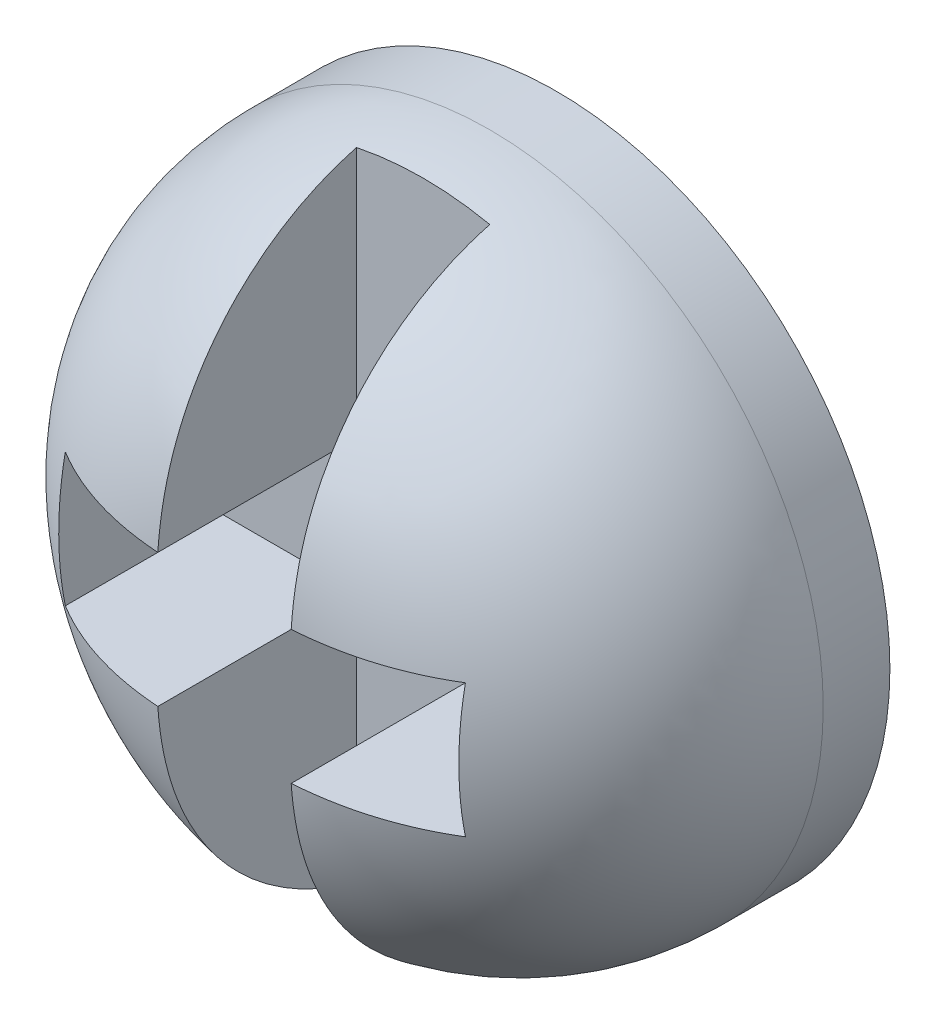
ISO-10303-21;
HEADER;
FILE_DESCRIPTION(('STEP AP214'),'2;1');
FILE_NAME('part.step','',(''),(''),'','','');
FILE_SCHEMA(('AUTOMOTIVE_DESIGN { 1 0 10303 214 1 1 1 1 }'));
ENDSEC;
DATA;
#1=APPLICATION_CONTEXT('core data for automotive mechanical design processes');
#2=APPLICATION_PROTOCOL_DEFINITION('international standard','automotive_design',2000,#1);
#3=PRODUCT_CONTEXT('',#1,'mechanical');
#4=PRODUCT('Part','Part','',(#3));
#5=PRODUCT_RELATED_PRODUCT_CATEGORY('part','',(#4));
#6=PRODUCT_DEFINITION_FORMATION('','',#4);
#7=PRODUCT_DEFINITION_CONTEXT('part definition',#1,'design');
#8=PRODUCT_DEFINITION('design','',#6,#7);
#9=PRODUCT_DEFINITION_SHAPE('','',#8);
#10=(LENGTH_UNIT() NAMED_UNIT(*) SI_UNIT(.MILLI.,.METRE.));
#11=(NAMED_UNIT(*) PLANE_ANGLE_UNIT() SI_UNIT($,.RADIAN.));
#12=(NAMED_UNIT(*) SI_UNIT($,.STERADIAN.) SOLID_ANGLE_UNIT());
#13=UNCERTAINTY_MEASURE_WITH_UNIT(LENGTH_MEASURE(1.E-05),#10,'distance_accuracy_value','');
#14=(GEOMETRIC_REPRESENTATION_CONTEXT(3) GLOBAL_UNCERTAINTY_ASSIGNED_CONTEXT((#13)) GLOBAL_UNIT_ASSIGNED_CONTEXT((#10,
#11,#12)) REPRESENTATION_CONTEXT('',''));
#15=CARTESIAN_POINT('',(0.,0.,0.));
#16=DIRECTION('',(0.,0.,1.));
#17=DIRECTION('',(1.,0.,0.));
#18=AXIS2_PLACEMENT_3D('',#15,#16,#17);
#19=CARTESIAN_POINT('',(64.0000001639128,11.5000002980232,18.6));
#20=DIRECTION('',(0.,0.,1.));
#21=DIRECTION('',(1.,0.,0.));
#22=AXIS2_PLACEMENT_3D('',#19,#20,#21);
#23=PLANE('',#22);
#24=CARTESIAN_POINT('',(64.0000001639128,11.5000002980232,18.6));
#25=DIRECTION('',(0.,0.,1.));
#26=DIRECTION('',(1.,0.,0.));
#27=AXIS2_PLACEMENT_3D('',#24,#25,#26);
#28=CIRCLE('',#27,1.5);
#29=CARTESIAN_POINT('',(65.5000001639128,11.5000002980232,18.6));
#30=VERTEX_POINT('',#29);
#31=EDGE_CURVE('E22',#30,#30,#28,.F.);
#32=ORIENTED_EDGE('',*,*,#31,.T.);
#33=EDGE_LOOP('',(#32));
#34=FACE_BOUND('',#33,.T.);
#35=ADVANCED_FACE('F17',(#34),#23,.F.);
#36=CARTESIAN_POINT('',(64.0000001639128,11.5000002980232,18.1));
#37=DIRECTION('',(0.,0.,1.));
#38=DIRECTION('',(1.,0.,0.));
#39=AXIS2_PLACEMENT_3D('',#36,#37,#38);
#40=CYLINDRICAL_SURFACE('',#39,1.5);
#41=CARTESIAN_POINT('',(64.0000001639128,11.5000002980232,18.1));
#42=DIRECTION('',(0.,0.,1.));
#43=DIRECTION('',(1.,0.,0.));
#44=AXIS2_PLACEMENT_3D('',#41,#42,#43);
#45=CIRCLE('',#44,1.5);
#46=CARTESIAN_POINT('',(65.5000001639128,11.5000002980232,18.1));
#47=VERTEX_POINT('',#46);
#48=EDGE_CURVE('E300',#47,#47,#45,.F.);
#49=ORIENTED_EDGE('',*,*,#48,.T.);
#50=EDGE_LOOP('',(#49));
#51=FACE_BOUND('',#50,.T.);
#52=ORIENTED_EDGE('',*,*,#31,.F.);
#53=EDGE_LOOP('',(#52));
#54=FACE_BOUND('',#53,.T.);
#55=ADVANCED_FACE('F282',(#51,#54),#40,.F.);
#56=CARTESIAN_POINT('',(64.0000001639128,11.5000002980232,18.1));
#57=DIRECTION('',(0.,0.,1.));
#58=DIRECTION('',(1.,0.,0.));
#59=AXIS2_PLACEMENT_3D('',#56,#57,#58);
#60=PLANE('',#59);
#61=ORIENTED_EDGE('',*,*,#48,.F.);
#62=EDGE_LOOP('',(#61));
#63=FACE_BOUND('',#62,.T.);
#64=CARTESIAN_POINT('',(64.0000001639128,11.5000002980232,18.1));
#65=DIRECTION('',(0.,0.,1.));
#66=DIRECTION('',(1.,0.,0.));
#67=AXIS2_PLACEMENT_3D('',#64,#65,#66);
#68=CIRCLE('',#67,2.5);
#69=CARTESIAN_POINT('',(66.5000001639128,11.5000002980232,18.1));
#70=VERTEX_POINT('',#69);
#71=EDGE_CURVE('E127',#70,#70,#68,.T.);
#72=ORIENTED_EDGE('',*,*,#71,.F.);
#73=EDGE_LOOP('',(#72));
#74=FACE_BOUND('',#73,.T.);
#75=ADVANCED_FACE('F279',(#63,#74),#60,.F.);
#76=CARTESIAN_POINT('',(64.0000001639128,11.5000002980232,19.1));
#77=DIRECTION('',(0.,0.,-1.));
#78=DIRECTION('',(-1.,0.,0.));
#79=AXIS2_PLACEMENT_3D('',#76,#77,#78);
#80=PLANE('',#79);
#81=DIRECTION('',(0.,1.,0.));
#82=VECTOR('',#81,1.);
#83=CARTESIAN_POINT('',(63.5000000745058,12.0000001788139,19.1));
#84=LINE('',#83,#82);
#85=CARTESIAN_POINT('',(63.5000000745058,13.8846368706893,19.1));
#86=VERTEX_POINT('',#85);
#87=CARTESIAN_POINT('',(63.5000000745058,12.0000001788139,19.1));
#88=VERTEX_POINT('',#87);
#89=EDGE_CURVE('E134',#86,#88,#84,.F.);
#90=ORIENTED_EDGE('',*,*,#89,.T.);
#91=DIRECTION('',(1.,0.,0.));
#92=VECTOR('',#91,1.);
#93=CARTESIAN_POINT('',(62.5000000596047,12.0000001788139,19.1));
#94=LINE('',#93,#92);
#95=CARTESIAN_POINT('',(62.5000000596047,12.0000001788139,19.1));
#96=VERTEX_POINT('',#95);
#97=EDGE_CURVE('E133',#88,#96,#94,.F.);
#98=ORIENTED_EDGE('',*,*,#97,.T.);
#99=DIRECTION('',(0.,1.,0.));
#100=VECTOR('',#99,1.);
#101=CARTESIAN_POINT('',(62.5000000596047,11.0000004172325,19.1));
#102=LINE('',#101,#100);
#103=CARTESIAN_POINT('',(62.5000000596047,11.0000004172325,19.1));
#104=VERTEX_POINT('',#103);
#105=EDGE_CURVE('E98',#96,#104,#102,.F.);
#106=ORIENTED_EDGE('',*,*,#105,.T.);
#107=DIRECTION('',(1.,0.,0.));
#108=VECTOR('',#107,1.);
#109=CARTESIAN_POINT('',(63.5000000745058,11.0000004172325,19.1));
#110=LINE('',#109,#108);
#111=CARTESIAN_POINT('',(63.5000000745058,11.0000004172325,19.1));
#112=VERTEX_POINT('',#111);
#113=EDGE_CURVE('E92',#104,#112,#110,.T.);
#114=ORIENTED_EDGE('',*,*,#113,.T.);
#115=DIRECTION('',(0.,1.,0.));
#116=VECTOR('',#115,1.);
#117=CARTESIAN_POINT('',(63.5000000745058,9.00000038743019,19.1));
#118=LINE('',#117,#116);
#119=CARTESIAN_POINT('',(63.5000000745058,9.1153637253571,19.1));
#120=VERTEX_POINT('',#119);
#121=EDGE_CURVE('E95',#112,#120,#118,.F.);
#122=ORIENTED_EDGE('',*,*,#121,.T.);
#123=CARTESIAN_POINT('',(64.0000001639128,11.5000002980232,19.1));
#124=DIRECTION('',(0.,0.,1.));
#125=DIRECTION('',(0.,-1.,0.));
#126=AXIS2_PLACEMENT_3D('',#123,#124,#125);
#127=CIRCLE('',#126,2.43649167310373);
#128=CARTESIAN_POINT('',(64.5000002533197,9.11536372535709,19.1));
#129=VERTEX_POINT('',#128);
#130=EDGE_CURVE('E35',#129,#120,#127,.F.);
#131=ORIENTED_EDGE('',*,*,#130,.F.);
#132=DIRECTION('',(0.,1.,0.));
#133=VECTOR('',#132,1.);
#134=CARTESIAN_POINT('',(64.5000002533197,11.0000004172325,19.1));
#135=LINE('',#134,#133);
#136=CARTESIAN_POINT('',(64.5000002533197,11.0000004172325,19.1));
#137=VERTEX_POINT('',#136);
#138=EDGE_CURVE('E109',#129,#137,#135,.T.);
#139=ORIENTED_EDGE('',*,*,#138,.T.);
#140=DIRECTION('',(1.,0.,0.));
#141=VECTOR('',#140,1.);
#142=CARTESIAN_POINT('',(65.5000002682209,11.0000004172325,19.1));
#143=LINE('',#142,#141);
#144=CARTESIAN_POINT('',(65.5000002682209,11.0000004172325,19.1));
#145=VERTEX_POINT('',#144);
#146=EDGE_CURVE('E160',#137,#145,#143,.T.);
#147=ORIENTED_EDGE('',*,*,#146,.T.);
#148=DIRECTION('',(0.,1.,0.));
#149=VECTOR('',#148,1.);
#150=CARTESIAN_POINT('',(65.5000002682209,12.0000001788139,19.1));
#151=LINE('',#150,#149);
#152=CARTESIAN_POINT('',(65.5000002682209,12.0000001788139,19.1));
#153=VERTEX_POINT('',#152);
#154=EDGE_CURVE('E154',#145,#153,#151,.T.);
#155=ORIENTED_EDGE('',*,*,#154,.T.);
#156=DIRECTION('',(1.,0.,0.));
#157=VECTOR('',#156,1.);
#158=CARTESIAN_POINT('',(64.5000002533197,12.0000001788139,19.1));
#159=LINE('',#158,#157);
#160=CARTESIAN_POINT('',(64.5000002533197,12.0000001788139,19.1));
#161=VERTEX_POINT('',#160);
#162=EDGE_CURVE('E148',#153,#161,#159,.F.);
#163=ORIENTED_EDGE('',*,*,#162,.T.);
#164=DIRECTION('',(0.,1.,0.));
#165=VECTOR('',#164,1.);
#166=CARTESIAN_POINT('',(64.5000002533197,14.0000002086163,19.1));
#167=LINE('',#166,#165);
#168=CARTESIAN_POINT('',(64.5000002533197,13.8846368706893,19.1));
#169=VERTEX_POINT('',#168);
#170=EDGE_CURVE('E138',#161,#169,#167,.T.);
#171=ORIENTED_EDGE('',*,*,#170,.T.);
#172=CARTESIAN_POINT('',(64.0000001639128,11.5000002980232,19.1));
#173=DIRECTION('',(0.,0.,1.));
#174=DIRECTION('',(0.,-1.,0.));
#175=AXIS2_PLACEMENT_3D('',#172,#173,#174);
#176=CIRCLE('',#175,2.43649167310373);
#177=EDGE_CURVE('E164',#86,#169,#176,.F.);
#178=ORIENTED_EDGE('',*,*,#177,.F.);
#179=EDGE_LOOP('',(#90,#98,#106,#114,#122,#131,#139,#147,#155,#163,#171,#178));
#180=FACE_BOUND('',#179,.T.);
#181=ADVANCED_FACE('F94',(#180),#80,.F.);
#182=CARTESIAN_POINT('',(65.5000002682209,11.0000004172325,20.6));
#183=DIRECTION('',(0.,-1.,0.));
#184=DIRECTION('',(0.,0.,-1.));
#185=AXIS2_PLACEMENT_3D('',#182,#183,#184);
#186=PLANE('',#185);
#187=DIRECTION('',(0.,0.,-1.));
#188=VECTOR('',#187,1.);
#189=CARTESIAN_POINT('',(65.5000002682209,11.0000004172325,20.6));
#190=LINE('',#189,#188);
#191=CARTESIAN_POINT('',(65.5000002682209,11.0000004172325,20.2825987928283));
#192=VERTEX_POINT('',#191);
#193=EDGE_CURVE('E157',#192,#145,#190,.T.);
#194=ORIENTED_EDGE('',*,*,#193,.T.);
#195=ORIENTED_EDGE('',*,*,#146,.F.);
#196=DIRECTION('',(0.,0.,-1.));
#197=VECTOR('',#196,1.);
#198=CARTESIAN_POINT('',(64.5000002533197,11.0000004172325,20.6));
#199=LINE('',#198,#197);
#200=CARTESIAN_POINT('',(64.5000002533197,11.0000004172325,20.5892477950008));
#201=VERTEX_POINT('',#200);
#202=EDGE_CURVE('E312',#137,#201,#199,.F.);
#203=ORIENTED_EDGE('',*,*,#202,.T.);
#204=CARTESIAN_POINT('',(64.5000002533197,11.0000004172325,20.5892477950008));
#205=CARTESIAN_POINT('',(64.5301744564889,11.0000004172325,20.5870307534008));
#206=CARTESIAN_POINT('',(64.5603153810707,11.0000004172325,20.5843593585185));
#207=CARTESIAN_POINT('',(64.6204980269368,11.0000004172325,20.5780134677192));
#208=CARTESIAN_POINT('',(64.6505397233875,11.0000004172325,20.5743387374909));
#209=CARTESIAN_POINT('',(64.7405166838281,11.0000004172325,20.5616597416849));
#210=CARTESIAN_POINT('',(64.8002322691741,11.0000004172325,20.5510054675048));
#211=CARTESIAN_POINT('',(64.9174184016644,11.0000004172325,20.5251733700863));
#212=CARTESIAN_POINT('',(64.9749099403436,11.0000004172325,20.5100910257166));
#213=CARTESIAN_POINT('',(65.0883997054862,11.0000004172325,20.4752083890934));
#214=CARTESIAN_POINT('',(65.1443991201238,11.0000004172325,20.4554119835488));
#215=CARTESIAN_POINT('',(65.2512380741686,11.0000004172325,20.4124051192374));
#216=CARTESIAN_POINT('',(65.3021868528751,11.0000004172325,20.3894660244377));
#217=CARTESIAN_POINT('',(65.4025142734329,11.0000004172325,20.3392566441537));
#218=CARTESIAN_POINT('',(65.4518731841039,11.0000004172325,20.3119469506931));
#219=CARTESIAN_POINT('',(65.5000002682209,11.0000004172325,20.2825987928283));
#220=B_SPLINE_CURVE_WITH_KNOTS('',3,(#204,#205,#206,#207,#208,#209,#210,#211,#212,#213,#214,
#215,#216,#217,#218,#219),.UNSPECIFIED.,.F.,.F.,(4,2,2,2,2,2,2,4),(0.,0.0907616133337531,
0.181544440596269,0.363324744925353,0.541442048396842,0.719413000852486,0.886852006620134,
1.05589595738661),.UNSPECIFIED.);
#221=EDGE_CURVE('E262',#201,#192,#220,.T.);
#222=ORIENTED_EDGE('',*,*,#221,.T.);
#223=EDGE_LOOP('',(#194,#195,#203,#222));
#224=FACE_BOUND('',#223,.T.);
#225=ADVANCED_FACE('F271',(#224),#186,.F.);
#226=CARTESIAN_POINT('',(65.5000002682209,12.0000001788139,20.6));
#227=DIRECTION('',(1.,0.,0.));
#228=DIRECTION('',(0.,0.,-1.));
#229=AXIS2_PLACEMENT_3D('',#226,#227,#228);
#230=PLANE('',#229);
#231=DIRECTION('',(0.,0.,1.));
#232=VECTOR('',#231,1.);
#233=CARTESIAN_POINT('',(65.5000002682209,12.0000001788139,20.6));
#234=LINE('',#233,#232);
#235=CARTESIAN_POINT('',(65.5000002682209,12.0000001788139,20.2825987928283));
#236=VERTEX_POINT('',#235);
#237=EDGE_CURVE('E151',#236,#153,#234,.F.);
#238=ORIENTED_EDGE('',*,*,#237,.T.);
#239=ORIENTED_EDGE('',*,*,#154,.F.);
#240=ORIENTED_EDGE('',*,*,#193,.F.);
#241=CARTESIAN_POINT('',(65.5000002682209,11.0000004172325,20.2825987928283));
#242=CARTESIAN_POINT('',(65.5000002682209,11.069321455518,20.2966593144847));
#243=CARTESIAN_POINT('',(65.5000002682209,11.1392423684059,20.3076475412896));
#244=CARTESIAN_POINT('',(65.5000002682209,11.279815783551,20.323674038282));
#245=CARTESIAN_POINT('',(65.5000002682209,11.3504687626575,20.3287081475466));
#246=CARTESIAN_POINT('',(65.5000002682209,11.4907890668477,20.332966999663));
#247=CARTESIAN_POINT('',(65.5000002682209,11.5604537268742,20.332284923555));
#248=CARTESIAN_POINT('',(65.5000002682209,11.6994677392765,20.3253035176366));
#249=CARTESIAN_POINT('',(65.5000002682209,11.7688172817897,20.3190082125002));
#250=CARTESIAN_POINT('',(65.5000002682209,11.8649030981505,20.3061987918614));
#251=CARTESIAN_POINT('',(65.5000002682209,11.8919807628943,20.3021319028625));
#252=CARTESIAN_POINT('',(65.5000002682209,11.9460698586209,20.2930681349645));
#253=CARTESIAN_POINT('',(65.5000002682209,11.9730807925586,20.2880682923365));
#254=CARTESIAN_POINT('',(65.5000002682209,12.000000178814,20.2825987928287));
#255=B_SPLINE_CURVE_WITH_KNOTS('',3,(#241,#242,#243,#244,#245,#246,#247,#248,#249,#250,#251,
#252,#253,#254),.UNSPECIFIED.,.F.,.F.,(4,2,2,2,2,2,4),(0.,0.212096412124021,0.424340956422378,
0.633132460848381,0.841774382458413,0.923905825332055,1.00630276096817),.UNSPECIFIED.);
#256=EDGE_CURVE('E256',#192,#236,#255,.T.);
#257=ORIENTED_EDGE('',*,*,#256,.T.);
#258=EDGE_LOOP('',(#238,#239,#240,#257));
#259=FACE_BOUND('',#258,.T.);
#260=ADVANCED_FACE('F268',(#259),#230,.F.);
#261=CARTESIAN_POINT('',(64.5000002533197,12.0000001788139,20.6));
#262=DIRECTION('',(0.,1.,0.));
#263=DIRECTION('',(0.,0.,1.));
#264=AXIS2_PLACEMENT_3D('',#261,#262,#263);
#265=PLANE('',#264);
#266=DIRECTION('',(0.,0.,-1.));
#267=VECTOR('',#266,1.);
#268=CARTESIAN_POINT('',(64.5000002533197,12.0000001788139,20.6));
#269=LINE('',#268,#267);
#270=CARTESIAN_POINT('',(64.5000002533197,12.0000001788139,20.5892477950008));
#271=VERTEX_POINT('',#270);
#272=EDGE_CURVE('E143',#271,#161,#269,.T.);
#273=ORIENTED_EDGE('',*,*,#272,.T.);
#274=ORIENTED_EDGE('',*,*,#162,.F.);
#275=ORIENTED_EDGE('',*,*,#237,.F.);
#276=CARTESIAN_POINT('',(65.5000002682209,12.0000001788139,20.2825987928283));
#277=CARTESIAN_POINT('',(65.4502525384023,12.0000001788139,20.3129372434888));
#278=CARTESIAN_POINT('',(65.3991859715665,12.0000001788139,20.3410962218399));
#279=CARTESIAN_POINT('',(65.2948514212962,12.0000001788139,20.3929460324517));
#280=CARTESIAN_POINT('',(65.2415841394412,12.0000001788139,20.4166382754938));
#281=CARTESIAN_POINT('',(65.1342267132067,12.0000001788139,20.4590795685347));
#282=CARTESIAN_POINT('',(65.0801686045558,12.0000001788139,20.4779098683678));
#283=CARTESIAN_POINT('',(64.9707380594872,12.0000001788139,20.5111811310315));
#284=CARTESIAN_POINT('',(64.9153659344229,12.0000001788139,20.525623122685));
#285=CARTESIAN_POINT('',(64.8006484759739,12.0000001788139,20.5509165422981));
#286=CARTESIAN_POINT('',(64.7412507589601,12.0000001788139,20.5615301745111));
#287=CARTESIAN_POINT('',(64.6514197031776,12.0000001788139,20.5742276165173));
#288=CARTESIAN_POINT('',(64.6212029270813,12.0000001788139,20.5779330828908));
#289=CARTESIAN_POINT('',(64.56066871977,12.0000001788139,20.5843280831835));
#290=CARTESIAN_POINT('',(64.530351314001,12.0000001788139,20.5870178567303));
#291=CARTESIAN_POINT('',(64.5000002533197,12.0000001788139,20.5892477950008));
#292=B_SPLINE_CURVE_WITH_KNOTS('',3,(#276,#277,#278,#279,#280,#281,#282,#283,#284,#285,#286,
#287,#288,#289,#290,#291),.UNSPECIFIED.,.F.,.F.,(4,2,2,2,2,2,2,4),(0.,0.174738975943412,
0.349422669233272,0.520964249052245,0.692465580481992,0.8732876133117,0.964602713879169,
1.05589625741771),.UNSPECIFIED.);
#293=EDGE_CURVE('E250',#236,#271,#292,.T.);
#294=ORIENTED_EDGE('',*,*,#293,.T.);
#295=EDGE_LOOP('',(#273,#274,#275,#294));
#296=FACE_BOUND('',#295,.T.);
#297=ADVANCED_FACE('F240',(#296),#265,.F.);
#298=CARTESIAN_POINT('',(64.5000002533197,14.0000002086163,20.6));
#299=DIRECTION('',(1.,0.,0.));
#300=DIRECTION('',(0.,0.,-1.));
#301=AXIS2_PLACEMENT_3D('',#298,#299,#300);
#302=PLANE('',#301);
#303=ORIENTED_EDGE('',*,*,#170,.F.);
#304=ORIENTED_EDGE('',*,*,#272,.F.);
#305=CARTESIAN_POINT('',(64.5000002533197,12.0000001788139,20.5892477950008));
#306=CARTESIAN_POINT('',(64.5000002533197,12.0298359326994,20.5870555795636));
#307=CARTESIAN_POINT('',(64.5000002533197,12.059639387711,20.5844191712311));
#308=CARTESIAN_POINT('',(64.5000002533197,12.1191489889217,20.5781667335123));
#309=CARTESIAN_POINT('',(64.5000002533197,12.1488551140338,20.5745505044315));
#310=CARTESIAN_POINT('',(64.5000002533197,12.2378066184624,20.562090254738));
#311=CARTESIAN_POINT('',(64.5000002533197,12.2968382183951,20.5516378235179));
#312=CARTESIAN_POINT('',(64.5000002533197,12.4140481385821,20.5260247904605));
#313=CARTESIAN_POINT('',(64.5000002533197,12.4722237141858,20.510851511285));
#314=CARTESIAN_POINT('',(64.5000002533197,12.5870626132383,20.4756823451259));
#315=CARTESIAN_POINT('',(64.5000002533197,12.6437264813108,20.4556882217382));
#316=CARTESIAN_POINT('',(64.5000002533197,12.8114367771529,20.3881618369354));
#317=CARTESIAN_POINT('',(64.5000002533197,12.9196170417068,20.333209866423));
#318=CARTESIAN_POINT('',(64.5000002533197,13.1241778656817,20.2049071087119));
#319=CARTESIAN_POINT('',(64.5000002533197,13.2205768752844,20.131585653176));
#320=CARTESIAN_POINT('',(64.5000002533197,13.3933873451221,19.9733829022926));
#321=CARTESIAN_POINT('',(64.5000002533197,13.4706282555186,19.8894062178756));
#322=CARTESIAN_POINT('',(64.5000002533197,13.6095323418571,19.709370255379));
#323=CARTESIAN_POINT('',(64.5000002533197,13.6711957284203,19.6133111406903));
#324=CARTESIAN_POINT('',(64.5000002533197,13.7585424475735,19.4471704487028));
#325=CARTESIAN_POINT('',(64.5000002533197,13.7892773896087,19.3796922235391));
#326=CARTESIAN_POINT('',(64.5000002533197,13.8428942376644,19.2418409243894));
#327=CARTESIAN_POINT('',(64.5000002533197,13.8657917413938,19.1714739159819));
#328=CARTESIAN_POINT('',(64.5000002533197,13.8846368706893,19.1));
#329=B_SPLINE_CURVE_WITH_KNOTS('',3,(#305,#306,#307,#308,#309,#310,#311,#312,#313,#314,#315,
#316,#317,#318,#319,#320,#321,#322,#323,#324,#325,#326,#327,#328),.UNSPECIFIED.,.F.,.F.,(4,2,2,
2,2,2,2,2,2,2,2,4),(0.,0.0897441972152641,0.17950669872138,0.359172433107249,0.539324866942615,
0.719411495845627,1.0813548504577,1.44272391125404,1.78335944192051,2.12399036666422,
2.34599518850132,2.56755558205703),.UNSPECIFIED.);
#330=EDGE_CURVE('E244',#271,#169,#329,.T.);
#331=ORIENTED_EDGE('',*,*,#330,.T.);
#332=EDGE_LOOP('',(#303,#304,#331));
#333=FACE_BOUND('',#332,.T.);
#334=ADVANCED_FACE('F235',(#333),#302,.F.);
#335=CARTESIAN_POINT('',(63.5000000745058,12.0000001788139,20.6));
#336=DIRECTION('',(-1.,0.,0.));
#337=DIRECTION('',(0.,0.,1.));
#338=AXIS2_PLACEMENT_3D('',#335,#336,#337);
#339=PLANE('',#338);
#340=DIRECTION('',(0.,0.,1.));
#341=VECTOR('',#340,1.);
#342=CARTESIAN_POINT('',(63.5000000745058,12.0000001788139,20.6));
#343=LINE('',#342,#341);
#344=CARTESIAN_POINT('',(63.5000000745058,12.0000001788139,20.5892477950008));
#345=VERTEX_POINT('',#344);
#346=EDGE_CURVE('E130',#345,#88,#343,.F.);
#347=ORIENTED_EDGE('',*,*,#346,.T.);
#348=ORIENTED_EDGE('',*,*,#89,.F.);
#349=CARTESIAN_POINT('',(63.5000000745058,13.8846368706893,19.1));
#350=CARTESIAN_POINT('',(63.5000000745058,13.8705133309303,19.1535351083793));
#351=CARTESIAN_POINT('',(63.5000000745058,13.854128659554,19.2064459201375));
#352=CARTESIAN_POINT('',(63.5000000745058,13.8169525226331,19.3106918776229));
#353=CARTESIAN_POINT('',(63.5000000745058,13.7961613646724,19.3620271330417));
#354=CARTESIAN_POINT('',(63.5000000745058,13.7273979761196,19.5130801280399));
#355=CARTESIAN_POINT('',(63.5000000745058,13.6730044894329,19.6099633722684));
#356=CARTESIAN_POINT('',(63.5000000745058,13.5487507349276,19.7932008925998));
#357=CARTESIAN_POINT('',(63.5000000745058,13.4788866336352,19.8795525508356));
#358=CARTESIAN_POINT('',(63.5000000745058,13.3257795826054,20.039325292092));
#359=CARTESIAN_POINT('',(63.5000000745058,13.2425474416418,20.1127567221306));
#360=CARTESIAN_POINT('',(63.5000000745058,13.0645863098292,20.2452332845218));
#361=CARTESIAN_POINT('',(63.5000000745058,12.9697918209415,20.3041901629584));
#362=CARTESIAN_POINT('',(63.5000000745058,12.7716885692779,20.4058848559833));
#363=CARTESIAN_POINT('',(63.5000000745058,12.6683692934243,20.4486022683342));
#364=CARTESIAN_POINT('',(63.5000000745058,12.5168871068095,20.4976958985319));
#365=CARTESIAN_POINT('',(63.5000000745058,12.4708277587978,20.5109127851605));
#366=CARTESIAN_POINT('',(63.5000000745058,12.377931223816,20.5343253171878));
#367=CARTESIAN_POINT('',(63.5000000745058,12.3310939429914,20.5445205952036));
#368=CARTESIAN_POINT('',(63.5000000745058,12.2370431327757,20.561968014688));
#369=CARTESIAN_POINT('',(63.5000000745058,12.1898313336514,20.5692296674351));
#370=CARTESIAN_POINT('',(63.5000000745058,12.0951023844325,20.5811320488146));
#371=CARTESIAN_POINT('',(63.5000000745058,12.0475854185436,20.5857742312373));
#372=CARTESIAN_POINT('',(63.5000000745058,12.0000001788139,20.5892477950008));
#373=B_SPLINE_CURVE_WITH_KNOTS('',3,(#349,#350,#351,#352,#353,#354,#355,#356,#357,#358,#359,
#360,#361,#362,#363,#364,#365,#366,#367,#368,#369,#370,#371,#372),.UNSPECIFIED.,.F.,.F.,(4,2,2,
2,2,2,2,2,2,2,2,4),(0.,0.165997532521855,0.331983481808822,0.663593003020674,0.995284786104237,
1.32670971644028,1.66010783672624,1.99392344386369,2.13760145657587,2.28129693125123,
2.42452270960489,2.56766892013227),.UNSPECIFIED.);
#374=EDGE_CURVE('E220',#86,#345,#373,.T.);
#375=ORIENTED_EDGE('',*,*,#374,.T.);
#376=EDGE_LOOP('',(#347,#348,#375));
#377=FACE_BOUND('',#376,.T.);
#378=ADVANCED_FACE('F230',(#377),#339,.F.);
#379=CARTESIAN_POINT('',(62.5000000596047,12.0000001788139,20.6));
#380=DIRECTION('',(0.,1.,0.));
#381=DIRECTION('',(0.,0.,1.));
#382=AXIS2_PLACEMENT_3D('',#379,#380,#381);
#383=PLANE('',#382);
#384=DIRECTION('',(0.,0.,1.));
#385=VECTOR('',#384,1.);
#386=CARTESIAN_POINT('',(62.5000000596047,12.0000001788139,20.6));
#387=LINE('',#386,#385);
#388=CARTESIAN_POINT('',(62.5000000596047,12.0000001788139,20.2825987928283));
#389=VERTEX_POINT('',#388);
#390=EDGE_CURVE('E124',#389,#96,#387,.F.);
#391=ORIENTED_EDGE('',*,*,#390,.T.);
#392=ORIENTED_EDGE('',*,*,#97,.F.);
#393=ORIENTED_EDGE('',*,*,#346,.F.);
#394=CARTESIAN_POINT('',(63.5000000745058,12.0000001788139,20.5892477950008));
#395=CARTESIAN_POINT('',(63.4698258713366,12.0000001788139,20.5870307534008));
#396=CARTESIAN_POINT('',(63.4396849467548,12.0000001788139,20.5843593585185));
#397=CARTESIAN_POINT('',(63.3795023008887,12.0000001788139,20.5780134677192));
#398=CARTESIAN_POINT('',(63.349460604438,12.0000001788139,20.5743387374909));
#399=CARTESIAN_POINT('',(63.2594836439974,12.0000001788139,20.5616597416849));
#400=CARTESIAN_POINT('',(63.1997680586514,12.0000001788139,20.5510054675047));
#401=CARTESIAN_POINT('',(63.0825819261611,12.0000001788139,20.5251733700862));
#402=CARTESIAN_POINT('',(63.0250903874818,12.0000001788139,20.5100910257166));
#403=CARTESIAN_POINT('',(62.9116006223393,12.0000001788139,20.4752083890933));
#404=CARTESIAN_POINT('',(62.8556012077016,12.0000001788139,20.4554119835487));
#405=CARTESIAN_POINT('',(62.7487622536568,12.0000001788139,20.4124051192374));
#406=CARTESIAN_POINT('',(62.6978134749504,12.0000001788139,20.3894660244377));
#407=CARTESIAN_POINT('',(62.5974860543927,12.0000001788139,20.3392566441536));
#408=CARTESIAN_POINT('',(62.5481271437217,12.0000001788139,20.3119469506931));
#409=CARTESIAN_POINT('',(62.5000000596047,12.0000001788139,20.2825987928283));
#410=B_SPLINE_CURVE_WITH_KNOTS('',3,(#394,#395,#396,#397,#398,#399,#400,#401,#402,#403,#404,
#405,#406,#407,#408,#409),.UNSPECIFIED.,.F.,.F.,(4,2,2,2,2,2,2,4),(0.,0.0907616133337676,
0.181544440596298,0.363324744925398,0.541442048396904,0.719413000852569,0.886852006620129,
1.05589595738651),.UNSPECIFIED.);
#411=EDGE_CURVE('E213',#345,#389,#410,.T.);
#412=ORIENTED_EDGE('',*,*,#411,.T.);
#413=EDGE_LOOP('',(#391,#392,#393,#412));
#414=FACE_BOUND('',#413,.T.);
#415=ADVANCED_FACE('F226',(#414),#383,.F.);
#416=CARTESIAN_POINT('',(64.0000001639128,11.5000002980232,18.1));
#417=DIRECTION('',(0.,0.,1.));
#418=DIRECTION('',(1.,0.,0.));
#419=AXIS2_PLACEMENT_3D('',#416,#417,#418);
#420=CYLINDRICAL_SURFACE('',#419,2.5);
#421=ORIENTED_EDGE('',*,*,#71,.T.);
#422=EDGE_LOOP('',(#421));
#423=FACE_BOUND('',#422,.T.);
#424=CARTESIAN_POINT('',(64.0000001639128,11.5000002980232,18.6));
#425=DIRECTION('',(0.,0.,-1.));
#426=DIRECTION('',(0.,1.,0.));
#427=AXIS2_PLACEMENT_3D('',#424,#425,#426);
#428=CIRCLE('',#427,2.49999999999999);
#429=CARTESIAN_POINT('',(64.0000001639128,14.0000002980232,18.6));
#430=VERTEX_POINT('',#429);
#431=EDGE_CURVE('E207',#430,#430,#428,.T.);
#432=ORIENTED_EDGE('',*,*,#431,.T.);
#433=EDGE_LOOP('',(#432));
#434=FACE_BOUND('',#433,.T.);
#435=ADVANCED_FACE('F229',(#423,#434),#420,.T.);
#436=CARTESIAN_POINT('',(62.5000000596047,11.0000004172325,20.6));
#437=DIRECTION('',(-1.,0.,0.));
#438=DIRECTION('',(0.,0.,1.));
#439=AXIS2_PLACEMENT_3D('',#436,#437,#438);
#440=PLANE('',#439);
#441=DIRECTION('',(0.,0.,-1.));
#442=VECTOR('',#441,1.);
#443=CARTESIAN_POINT('',(62.5000000596047,11.0000004172325,20.6));
#444=LINE('',#443,#442);
#445=CARTESIAN_POINT('',(62.5000000596047,11.0000004172325,20.2825987928283));
#446=VERTEX_POINT('',#445);
#447=EDGE_CURVE('E104',#446,#104,#444,.T.);
#448=ORIENTED_EDGE('',*,*,#447,.T.);
#449=ORIENTED_EDGE('',*,*,#105,.F.);
#450=ORIENTED_EDGE('',*,*,#390,.F.);
#451=CARTESIAN_POINT('',(62.5000000596047,12.0000001788139,20.2825987928283));
#452=CARTESIAN_POINT('',(62.5000000596047,11.9173667846183,20.2993371185978));
#453=CARTESIAN_POINT('',(62.5000000596047,11.8339024008079,20.3117389991525));
#454=CARTESIAN_POINT('',(62.5000000596047,11.6669534996168,20.3280555671927));
#455=CARTESIAN_POINT('',(62.5000000596047,11.58347689882,20.3320507473466));
#456=CARTESIAN_POINT('',(62.5000000596047,11.4165236972264,20.3320507473466));
#457=CARTESIAN_POINT('',(62.5000000596047,11.3330470964296,20.3280555671927));
#458=CARTESIAN_POINT('',(62.5000000596047,11.1660981952385,20.3117389991525));
#459=CARTESIAN_POINT('',(62.5000000596047,11.0826338114281,20.2993371185978));
#460=CARTESIAN_POINT('',(62.5000000596047,11.0000004172325,20.2825987928283));
#461=B_SPLINE_CURVE_WITH_KNOTS('',3,(#451,#452,#453,#454,#455,#456,#457,#458,#459,#460),
.UNSPECIFIED.,.F.,.F.,(4,2,2,2,4),(0.,0.252748778481387,0.503066309950735,0.753383841420086,
1.00613261990148),.UNSPECIFIED.);
#462=EDGE_CURVE('E208',#389,#446,#461,.T.);
#463=ORIENTED_EDGE('',*,*,#462,.T.);
#464=EDGE_LOOP('',(#448,#449,#450,#463));
#465=FACE_BOUND('',#464,.T.);
#466=ADVANCED_FACE('F200',(#465),#440,.F.);
#467=CARTESIAN_POINT('',(63.5000000745058,11.0000004172325,20.6));
#468=DIRECTION('',(0.,-1.,0.));
#469=DIRECTION('',(0.,0.,-1.));
#470=AXIS2_PLACEMENT_3D('',#467,#468,#469);
#471=PLANE('',#470);
#472=DIRECTION('',(0.,0.,1.));
#473=VECTOR('',#472,1.);
#474=CARTESIAN_POINT('',(63.5000000745058,11.0000004172325,20.6));
#475=LINE('',#474,#473);
#476=CARTESIAN_POINT('',(63.5000000745058,11.0000004172325,20.5892477950008));
#477=VERTEX_POINT('',#476);
#478=EDGE_CURVE('E103',#477,#112,#475,.F.);
#479=ORIENTED_EDGE('',*,*,#478,.T.);
#480=ORIENTED_EDGE('',*,*,#113,.F.);
#481=ORIENTED_EDGE('',*,*,#447,.F.);
#482=CARTESIAN_POINT('',(62.5000000596047,11.0000004172325,20.2825987928283));
#483=CARTESIAN_POINT('',(62.5497477894233,11.0000004172325,20.3129372434888));
#484=CARTESIAN_POINT('',(62.6008143562591,11.0000004172325,20.3410962218399));
#485=CARTESIAN_POINT('',(62.7051489065294,11.0000004172325,20.3929460324517));
#486=CARTESIAN_POINT('',(62.7584161883843,11.0000004172325,20.4166382754938));
#487=CARTESIAN_POINT('',(62.8657736146188,11.0000004172325,20.4590795685347));
#488=CARTESIAN_POINT('',(62.9198317232697,11.0000004172325,20.4779098683678));
#489=CARTESIAN_POINT('',(63.0292622683384,11.0000004172325,20.5111811310315));
#490=CARTESIAN_POINT('',(63.0846343934026,11.0000004172325,20.525623122685));
#491=CARTESIAN_POINT('',(63.1993518518516,11.0000004172325,20.5509165422981));
#492=CARTESIAN_POINT('',(63.2587495688654,11.0000004172325,20.5615301745111));
#493=CARTESIAN_POINT('',(63.3485806246479,11.0000004172325,20.5742276165173));
#494=CARTESIAN_POINT('',(63.3787974007442,11.0000004172325,20.5779330828908));
#495=CARTESIAN_POINT('',(63.4393316080555,11.0000004172325,20.5843280831835));
#496=CARTESIAN_POINT('',(63.4696490138245,11.0000004172325,20.5870178567303));
#497=CARTESIAN_POINT('',(63.5000000745058,11.0000004172325,20.5892477950008));
#498=B_SPLINE_CURVE_WITH_KNOTS('',3,(#482,#483,#484,#485,#486,#487,#488,#489,#490,#491,#492,
#493,#494,#495,#496,#497),.UNSPECIFIED.,.F.,.F.,(4,2,2,2,2,2,2,4),(0.,0.17473897594341,
0.349422669233256,0.520964249052202,0.692465580481964,0.873287613311659,0.9646027138791,
1.05589625741763),.UNSPECIFIED.);
#499=EDGE_CURVE('E114',#446,#477,#498,.T.);
#500=ORIENTED_EDGE('',*,*,#499,.T.);
#501=EDGE_LOOP('',(#479,#480,#481,#500));
#502=FACE_BOUND('',#501,.T.);
#503=ADVANCED_FACE('F112',(#502),#471,.F.);
#504=CARTESIAN_POINT('',(63.5000000745058,9.00000038743019,20.6));
#505=DIRECTION('',(-1.,0.,0.));
#506=DIRECTION('',(0.,0.,1.));
#507=AXIS2_PLACEMENT_3D('',#504,#505,#506);
#508=PLANE('',#507);
#509=ORIENTED_EDGE('',*,*,#121,.F.);
#510=ORIENTED_EDGE('',*,*,#478,.F.);
#511=CARTESIAN_POINT('',(63.5000000745058,11.0000004172325,20.5892477950008));
#512=CARTESIAN_POINT('',(63.5000000745058,10.970164663347,20.5870555795636));
#513=CARTESIAN_POINT('',(63.5000000745058,10.9403612083354,20.5844191712311));
#514=CARTESIAN_POINT('',(63.5000000745058,10.8808516071247,20.5781667335123));
#515=CARTESIAN_POINT('',(63.5000000745058,10.8511454820126,20.5745505044315));
#516=CARTESIAN_POINT('',(63.5000000745058,10.762193977584,20.562090254738));
#517=CARTESIAN_POINT('',(63.5000000745058,10.7031623776513,20.5516378235179));
#518=CARTESIAN_POINT('',(63.5000000745058,10.5859524574642,20.5260247904605));
#519=CARTESIAN_POINT('',(63.5000000745058,10.5277768818605,20.5108515112849));
#520=CARTESIAN_POINT('',(63.5000000745058,10.4129379828081,20.4756823451258));
#521=CARTESIAN_POINT('',(63.5000000745058,10.3562741147355,20.4556882217382));
#522=CARTESIAN_POINT('',(63.5000000745058,10.1885638188934,20.3881618369354));
#523=CARTESIAN_POINT('',(63.5000000745058,10.0803835543396,20.333209866423));
#524=CARTESIAN_POINT('',(63.5000000745058,9.87582273036467,20.2049071087118));
#525=CARTESIAN_POINT('',(63.5000000745058,9.77942372076189,20.131585653176));
#526=CARTESIAN_POINT('',(63.5000000745058,9.60661325092423,19.9733829022925));
#527=CARTESIAN_POINT('',(63.5000000745058,9.52937234052775,19.8894062178755));
#528=CARTESIAN_POINT('',(63.5000000745058,9.3904682541892,19.7093702553789));
#529=CARTESIAN_POINT('',(63.5000000745058,9.32880486762603,19.6133111406902));
#530=CARTESIAN_POINT('',(63.5000000745058,9.24145814847289,19.4471704487027));
#531=CARTESIAN_POINT('',(63.5000000745058,9.21072320643768,19.379692223539));
#532=CARTESIAN_POINT('',(63.5000000745058,9.15710635838199,19.2418409243893));
#533=CARTESIAN_POINT('',(63.5000000745058,9.13420885465262,19.1714739159819));
#534=CARTESIAN_POINT('',(63.5000000745058,9.11536372535708,19.1));
#535=B_SPLINE_CURVE_WITH_KNOTS('',3,(#511,#512,#513,#514,#515,#516,#517,#518,#519,#520,#521,
#522,#523,#524,#525,#526,#527,#528,#529,#530,#531,#532,#533,#534),.UNSPECIFIED.,.F.,.F.,(4,2,2,
2,2,2,2,2,2,2,2,4),(0.,0.0897441972152713,0.179506698721396,0.359172433107276,0.539324866942658,
0.71941149584568,1.08135485045779,1.44272391125415,1.78335944192061,2.12399036666433,
2.34599518850136,2.56755558205701),.UNSPECIFIED.);
#536=EDGE_CURVE('E28',#477,#120,#535,.T.);
#537=ORIENTED_EDGE('',*,*,#536,.T.);
#538=EDGE_LOOP('',(#509,#510,#537));
#539=FACE_BOUND('',#538,.T.);
#540=ADVANCED_FACE('F107',(#539),#508,.F.);
#541=CARTESIAN_POINT('',(64.5000002533197,11.0000004172325,20.6));
#542=DIRECTION('',(1.,0.,0.));
#543=DIRECTION('',(0.,0.,-1.));
#544=AXIS2_PLACEMENT_3D('',#541,#542,#543);
#545=PLANE('',#544);
#546=ORIENTED_EDGE('',*,*,#202,.F.);
#547=ORIENTED_EDGE('',*,*,#138,.F.);
#548=CARTESIAN_POINT('',(64.5000002533197,9.11536372535706,19.1));
#549=CARTESIAN_POINT('',(64.5000002533197,9.12948726511605,19.1535351083793));
#550=CARTESIAN_POINT('',(64.5000002533197,9.14587193649238,19.2064459201375));
#551=CARTESIAN_POINT('',(64.5000002533197,9.1830480734133,19.3106918776229));
#552=CARTESIAN_POINT('',(64.5000002533197,9.20383923137394,19.3620271330417));
#553=CARTESIAN_POINT('',(64.5000002533197,9.27260261992679,19.5130801280399));
#554=CARTESIAN_POINT('',(64.5000002533197,9.32699610661342,19.6099633722684));
#555=CARTESIAN_POINT('',(64.5000002533197,9.45124986111875,19.7932008925998));
#556=CARTESIAN_POINT('',(64.5000002533197,9.52111396241116,19.8795525508356));
#557=CARTESIAN_POINT('',(64.5000002533197,9.67422101344102,20.039325292092));
#558=CARTESIAN_POINT('',(64.5000002533197,9.7574531544046,20.1127567221306));
#559=CARTESIAN_POINT('',(64.5000002533197,9.93541428621713,20.2452332845218));
#560=CARTESIAN_POINT('',(64.5000002533197,10.0302087751049,20.3041901629584));
#561=CARTESIAN_POINT('',(64.5000002533197,10.2283120267685,20.4058848559833));
#562=CARTESIAN_POINT('',(64.5000002533197,10.3316313026221,20.4486022683342));
#563=CARTESIAN_POINT('',(64.5000002533197,10.4831134892369,20.4976958985319));
#564=CARTESIAN_POINT('',(64.5000002533197,10.5291728372486,20.5109127851605));
#565=CARTESIAN_POINT('',(64.5000002533197,10.6220693722304,20.5343253171878));
#566=CARTESIAN_POINT('',(64.5000002533197,10.668906653055,20.5445205952036));
#567=CARTESIAN_POINT('',(64.5000002533197,10.7629574632707,20.561968014688));
#568=CARTESIAN_POINT('',(64.5000002533197,10.810169262395,20.5692296674351));
#569=CARTESIAN_POINT('',(64.5000002533197,10.9048982116139,20.5811320488146));
#570=CARTESIAN_POINT('',(64.5000002533197,10.9524151775028,20.5857742312373));
#571=CARTESIAN_POINT('',(64.5000002533197,11.0000004172325,20.5892477950008));
#572=B_SPLINE_CURVE_WITH_KNOTS('',3,(#548,#549,#550,#551,#552,#553,#554,#555,#556,#557,#558,
#559,#560,#561,#562,#563,#564,#565,#566,#567,#568,#569,#570,#571),.UNSPECIFIED.,.F.,.F.,(4,2,2,
2,2,2,2,2,2,2,2,4),(0.,0.165997532521854,0.331983481808829,0.663593003020682,0.995284786104245,
1.32670971644029,1.66010783672626,1.99392344386371,2.13760145657589,2.28129693125126,
2.42452270960493,2.56766892013231),.UNSPECIFIED.);
#573=EDGE_CURVE('E11',#129,#201,#572,.T.);
#574=ORIENTED_EDGE('',*,*,#573,.T.);
#575=EDGE_LOOP('',(#546,#547,#574));
#576=FACE_BOUND('',#575,.T.);
#577=ADVANCED_FACE('F190',(#576),#545,.F.);
#578=CARTESIAN_POINT('',(64.0000001639128,11.5000002980232,18.6));
#579=DIRECTION('',(0.,0.,1.));
#580=DIRECTION('',(0.,-1.,0.));
#581=AXIS2_PLACEMENT_3D('',#578,#579,#580);
#582=DEGENERATE_TOROIDAL_SURFACE('',#581,0.500000000000028,1.99999999999999,.T.);
#583=ORIENTED_EDGE('',*,*,#431,.F.);
#584=EDGE_LOOP('',(#583));
#585=FACE_BOUND('',#584,.T.);
#586=ORIENTED_EDGE('',*,*,#130,.T.);
#587=ORIENTED_EDGE('',*,*,#536,.F.);
#588=ORIENTED_EDGE('',*,*,#499,.F.);
#589=ORIENTED_EDGE('',*,*,#462,.F.);
#590=ORIENTED_EDGE('',*,*,#411,.F.);
#591=ORIENTED_EDGE('',*,*,#374,.F.);
#592=ORIENTED_EDGE('',*,*,#177,.T.);
#593=ORIENTED_EDGE('',*,*,#330,.F.);
#594=ORIENTED_EDGE('',*,*,#293,.F.);
#595=ORIENTED_EDGE('',*,*,#256,.F.);
#596=ORIENTED_EDGE('',*,*,#221,.F.);
#597=ORIENTED_EDGE('',*,*,#573,.F.);
#598=EDGE_LOOP('',(#586,#587,#588,#589,#590,#591,#592,#593,#594,#595,#596,#597));
#599=FACE_BOUND('',#598,.T.);
#600=ADVANCED_FACE('F19',(#585,#599),#582,.T.);
#601=CLOSED_SHELL('',(#35,#55,#75,#181,#225,#260,#297,#334,#378,#415,#435,#466,#503,#540,#577,#600));
#602=MANIFOLD_SOLID_BREP('B1',#601);
#603=ADVANCED_BREP_SHAPE_REPRESENTATION('',(#18,#602),#14);
#604=SHAPE_DEFINITION_REPRESENTATION(#9,#603);
ENDSEC;
END-ISO-10303-21;
